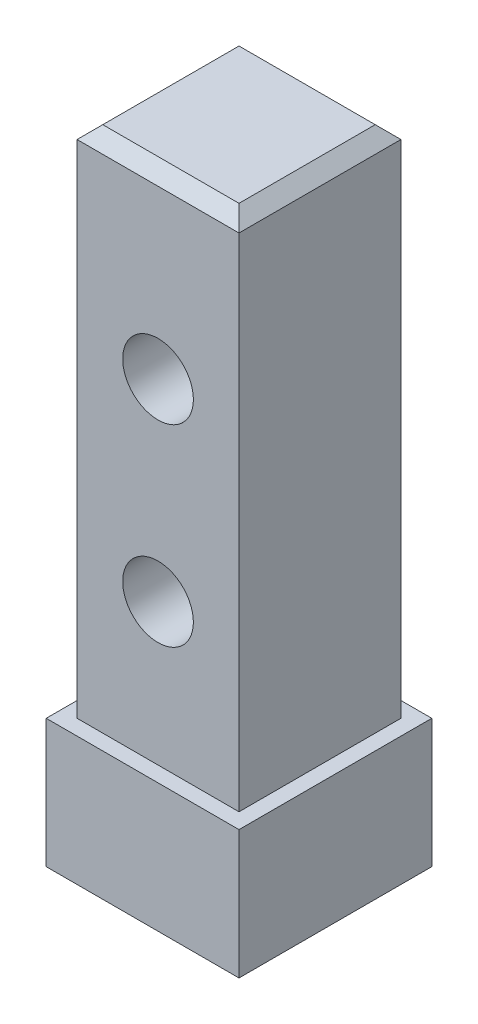
ISO-10303-21;
HEADER;
FILE_DESCRIPTION(('STEP AP214'),'2;1');
FILE_NAME('part.step','',(''),(''),'','','');
FILE_SCHEMA(('AUTOMOTIVE_DESIGN { 1 0 10303 214 1 1 1 1 }'));
ENDSEC;
DATA;
#1=APPLICATION_CONTEXT('core data for automotive mechanical design processes');
#2=APPLICATION_PROTOCOL_DEFINITION('international standard','automotive_design',2000,#1);
#3=PRODUCT_CONTEXT('',#1,'mechanical');
#4=PRODUCT('Part','Part','',(#3));
#5=PRODUCT_RELATED_PRODUCT_CATEGORY('part','',(#4));
#6=PRODUCT_DEFINITION_FORMATION('','',#4);
#7=PRODUCT_DEFINITION_CONTEXT('part definition',#1,'design');
#8=PRODUCT_DEFINITION('design','',#6,#7);
#9=PRODUCT_DEFINITION_SHAPE('','',#8);
#10=(LENGTH_UNIT() NAMED_UNIT(*) SI_UNIT(.MILLI.,.METRE.));
#11=(NAMED_UNIT(*) PLANE_ANGLE_UNIT() SI_UNIT($,.RADIAN.));
#12=(NAMED_UNIT(*) SI_UNIT($,.STERADIAN.) SOLID_ANGLE_UNIT());
#13=UNCERTAINTY_MEASURE_WITH_UNIT(LENGTH_MEASURE(1.E-05),#10,'distance_accuracy_value','');
#14=(GEOMETRIC_REPRESENTATION_CONTEXT(3) GLOBAL_UNCERTAINTY_ASSIGNED_CONTEXT((#13)) GLOBAL_UNIT_ASSIGNED_CONTEXT((#10,
#11,#12)) REPRESENTATION_CONTEXT('',''));
#15=CARTESIAN_POINT('',(0.,0.,0.));
#16=DIRECTION('',(0.,0.,1.));
#17=DIRECTION('',(1.,0.,0.));
#18=AXIS2_PLACEMENT_3D('',#15,#16,#17);
#19=CARTESIAN_POINT('',(-7.5,10.,-7.5));
#20=DIRECTION('',(0.,1.,0.));
#21=DIRECTION('',(0.,0.,1.));
#22=AXIS2_PLACEMENT_3D('',#19,#20,#21);
#23=PLANE('',#22);
#24=DIRECTION('',(-1.,0.,0.));
#25=VECTOR('',#24,1.);
#26=CARTESIAN_POINT('',(7.5,10.,-7.5));
#27=LINE('',#26,#25);
#28=CARTESIAN_POINT('',(7.5,10.,-7.5));
#29=VERTEX_POINT('',#28);
#30=CARTESIAN_POINT('',(-7.5,10.,-7.5));
#31=VERTEX_POINT('',#30);
#32=EDGE_CURVE('E160',#29,#31,#27,.T.);
#33=ORIENTED_EDGE('',*,*,#32,.T.);
#34=DIRECTION('',(0.,0.,1.));
#35=VECTOR('',#34,1.);
#36=CARTESIAN_POINT('',(-7.5,10.,-7.5));
#37=LINE('',#36,#35);
#38=CARTESIAN_POINT('',(-7.5,10.,7.5));
#39=VERTEX_POINT('',#38);
#40=EDGE_CURVE('E164',#31,#39,#37,.T.);
#41=ORIENTED_EDGE('',*,*,#40,.T.);
#42=DIRECTION('',(1.,0.,0.));
#43=VECTOR('',#42,1.);
#44=CARTESIAN_POINT('',(-7.5,10.,7.5));
#45=LINE('',#44,#43);
#46=CARTESIAN_POINT('',(7.5,10.,7.5));
#47=VERTEX_POINT('',#46);
#48=EDGE_CURVE('E168',#39,#47,#45,.T.);
#49=ORIENTED_EDGE('',*,*,#48,.T.);
#50=DIRECTION('',(0.,0.,-1.));
#51=VECTOR('',#50,1.);
#52=CARTESIAN_POINT('',(7.5,10.,7.5));
#53=LINE('',#52,#51);
#54=EDGE_CURVE('E171',#47,#29,#53,.T.);
#55=ORIENTED_EDGE('',*,*,#54,.T.);
#56=EDGE_LOOP('',(#33,#41,#49,#55));
#57=FACE_BOUND('',#56,.T.);
#58=DIRECTION('',(0.,0.,1.));
#59=VECTOR('',#58,1.);
#60=CARTESIAN_POINT('',(-6.3,10.,-6.3));
#61=LINE('',#60,#59);
#62=CARTESIAN_POINT('',(-6.3,10.,-6.3));
#63=VERTEX_POINT('',#62);
#64=CARTESIAN_POINT('',(-6.3,10.,6.3));
#65=VERTEX_POINT('',#64);
#66=EDGE_CURVE('E122',#63,#65,#61,.T.);
#67=ORIENTED_EDGE('',*,*,#66,.F.);
#68=DIRECTION('',(-1.,0.,0.));
#69=VECTOR('',#68,1.);
#70=CARTESIAN_POINT('',(6.3,10.,-6.3));
#71=LINE('',#70,#69);
#72=CARTESIAN_POINT('',(6.3,10.,-6.3));
#73=VERTEX_POINT('',#72);
#74=EDGE_CURVE('E131',#73,#63,#71,.T.);
#75=ORIENTED_EDGE('',*,*,#74,.F.);
#76=DIRECTION('',(0.,0.,-1.));
#77=VECTOR('',#76,1.);
#78=CARTESIAN_POINT('',(6.3,10.,6.3));
#79=LINE('',#78,#77);
#80=CARTESIAN_POINT('',(6.3,10.,6.3));
#81=VERTEX_POINT('',#80);
#82=EDGE_CURVE('E147',#81,#73,#79,.T.);
#83=ORIENTED_EDGE('',*,*,#82,.F.);
#84=DIRECTION('',(1.,0.,0.));
#85=VECTOR('',#84,1.);
#86=CARTESIAN_POINT('',(-6.3,10.,6.3));
#87=LINE('',#86,#85);
#88=EDGE_CURVE('E142',#65,#81,#87,.T.);
#89=ORIENTED_EDGE('',*,*,#88,.F.);
#90=EDGE_LOOP('',(#67,#75,#83,#89));
#91=FACE_BOUND('',#90,.T.);
#92=ADVANCED_FACE('F17',(#57,#91),#23,.T.);
#93=CARTESIAN_POINT('',(7.5,10.,-7.5));
#94=DIRECTION('',(0.,0.,1.));
#95=DIRECTION('',(1.,0.,0.));
#96=AXIS2_PLACEMENT_3D('',#93,#94,#95);
#97=PLANE('',#96);
#98=DIRECTION('',(-1.,0.,0.));
#99=VECTOR('',#98,1.);
#100=CARTESIAN_POINT('',(7.5,0.,-7.5));
#101=LINE('',#100,#99);
#102=CARTESIAN_POINT('',(7.5,0.,-7.5));
#103=VERTEX_POINT('',#102);
#104=CARTESIAN_POINT('',(-7.5,0.,-7.5));
#105=VERTEX_POINT('',#104);
#106=EDGE_CURVE('E127',#103,#105,#101,.T.);
#107=ORIENTED_EDGE('',*,*,#106,.T.);
#108=DIRECTION('',(0.,-1.,0.));
#109=VECTOR('',#108,1.);
#110=CARTESIAN_POINT('',(-7.5,10.,-7.5));
#111=LINE('',#110,#109);
#112=EDGE_CURVE('E197',#31,#105,#111,.T.);
#113=ORIENTED_EDGE('',*,*,#112,.F.);
#114=ORIENTED_EDGE('',*,*,#32,.F.);
#115=DIRECTION('',(0.,-1.,0.));
#116=VECTOR('',#115,1.);
#117=CARTESIAN_POINT('',(7.5,10.,-7.5));
#118=LINE('',#117,#116);
#119=EDGE_CURVE('E174',#29,#103,#118,.T.);
#120=ORIENTED_EDGE('',*,*,#119,.T.);
#121=EDGE_LOOP('',(#107,#113,#114,#120));
#122=FACE_BOUND('',#121,.T.);
#123=ADVANCED_FACE('F287',(#122),#97,.F.);
#124=CARTESIAN_POINT('',(-7.5,10.,-7.5));
#125=DIRECTION('',(1.,0.,0.));
#126=DIRECTION('',(0.,0.,-1.));
#127=AXIS2_PLACEMENT_3D('',#124,#125,#126);
#128=PLANE('',#127);
#129=DIRECTION('',(0.,0.,1.));
#130=VECTOR('',#129,1.);
#131=CARTESIAN_POINT('',(-7.5,0.,-7.5));
#132=LINE('',#131,#130);
#133=CARTESIAN_POINT('',(-7.5,0.,7.5));
#134=VERTEX_POINT('',#133);
#135=EDGE_CURVE('E178',#105,#134,#132,.T.);
#136=ORIENTED_EDGE('',*,*,#135,.T.);
#137=DIRECTION('',(0.,-1.,0.));
#138=VECTOR('',#137,1.);
#139=CARTESIAN_POINT('',(-7.5,10.,7.5));
#140=LINE('',#139,#138);
#141=EDGE_CURVE('E193',#39,#134,#140,.T.);
#142=ORIENTED_EDGE('',*,*,#141,.F.);
#143=ORIENTED_EDGE('',*,*,#40,.F.);
#144=ORIENTED_EDGE('',*,*,#112,.T.);
#145=EDGE_LOOP('',(#136,#142,#143,#144));
#146=FACE_BOUND('',#145,.T.);
#147=ADVANCED_FACE('F293',(#146),#128,.F.);
#148=CARTESIAN_POINT('',(-7.5,10.,7.5));
#149=DIRECTION('',(0.,0.,-1.));
#150=DIRECTION('',(-1.,0.,0.));
#151=AXIS2_PLACEMENT_3D('',#148,#149,#150);
#152=PLANE('',#151);
#153=DIRECTION('',(1.,0.,0.));
#154=VECTOR('',#153,1.);
#155=CARTESIAN_POINT('',(-7.5,0.,7.5));
#156=LINE('',#155,#154);
#157=CARTESIAN_POINT('',(7.5,0.,7.5));
#158=VERTEX_POINT('',#157);
#159=EDGE_CURVE('E181',#134,#158,#156,.T.);
#160=ORIENTED_EDGE('',*,*,#159,.T.);
#161=DIRECTION('',(0.,-1.,0.));
#162=VECTOR('',#161,1.);
#163=CARTESIAN_POINT('',(7.5,10.,7.5));
#164=LINE('',#163,#162);
#165=EDGE_CURVE('E189',#47,#158,#164,.T.);
#166=ORIENTED_EDGE('',*,*,#165,.F.);
#167=ORIENTED_EDGE('',*,*,#48,.F.);
#168=ORIENTED_EDGE('',*,*,#141,.T.);
#169=EDGE_LOOP('',(#160,#166,#167,#168));
#170=FACE_BOUND('',#169,.T.);
#171=ADVANCED_FACE('F306',(#170),#152,.F.);
#172=CARTESIAN_POINT('',(7.5,10.,7.5));
#173=DIRECTION('',(-1.,0.,0.));
#174=DIRECTION('',(0.,0.,1.));
#175=AXIS2_PLACEMENT_3D('',#172,#173,#174);
#176=PLANE('',#175);
#177=DIRECTION('',(0.,0.,-1.));
#178=VECTOR('',#177,1.);
#179=CARTESIAN_POINT('',(7.5,0.,7.5));
#180=LINE('',#179,#178);
#181=EDGE_CURVE('E165',#158,#103,#180,.T.);
#182=ORIENTED_EDGE('',*,*,#181,.T.);
#183=ORIENTED_EDGE('',*,*,#119,.F.);
#184=ORIENTED_EDGE('',*,*,#54,.F.);
#185=ORIENTED_EDGE('',*,*,#165,.T.);
#186=EDGE_LOOP('',(#182,#183,#184,#185));
#187=FACE_BOUND('',#186,.T.);
#188=ADVANCED_FACE('F302',(#187),#176,.F.);
#189=CARTESIAN_POINT('',(-7.5,0.,-7.5));
#190=DIRECTION('',(0.,1.,0.));
#191=DIRECTION('',(0.,0.,1.));
#192=AXIS2_PLACEMENT_3D('',#189,#190,#191);
#193=PLANE('',#192);
#194=CARTESIAN_POINT('',(0.,0.,0.));
#195=DIRECTION('',(0.,-1.,0.));
#196=DIRECTION('',(0.,0.,-1.));
#197=AXIS2_PLACEMENT_3D('',#194,#195,#196);
#198=CIRCLE('',#197,2.);
#199=CARTESIAN_POINT('',(0.,0.,-2.));
#200=VERTEX_POINT('',#199);
#201=EDGE_CURVE('E395',#200,#200,#198,.T.);
#202=ORIENTED_EDGE('',*,*,#201,.F.);
#203=EDGE_LOOP('',(#202));
#204=FACE_BOUND('',#203,.T.);
#205=ORIENTED_EDGE('',*,*,#106,.F.);
#206=ORIENTED_EDGE('',*,*,#181,.F.);
#207=ORIENTED_EDGE('',*,*,#159,.F.);
#208=ORIENTED_EDGE('',*,*,#135,.F.);
#209=EDGE_LOOP('',(#205,#206,#207,#208));
#210=FACE_BOUND('',#209,.T.);
#211=ADVANCED_FACE('F299',(#204,#210),#193,.F.);
#212=CARTESIAN_POINT('',(6.3,50.,-6.3));
#213=DIRECTION('',(0.,0.,1.));
#214=DIRECTION('',(1.,0.,0.));
#215=AXIS2_PLACEMENT_3D('',#212,#213,#214);
#216=PLANE('',#215);
#217=CARTESIAN_POINT('',(0.,36.,-6.3));
#218=DIRECTION('',(0.,0.,1.));
#219=DIRECTION('',(1.,0.,0.));
#220=AXIS2_PLACEMENT_3D('',#217,#218,#219);
#221=CIRCLE('',#220,2.75);
#222=CARTESIAN_POINT('',(2.75,36.,-6.3));
#223=VERTEX_POINT('',#222);
#224=EDGE_CURVE('E244',#223,#223,#221,.T.);
#225=ORIENTED_EDGE('',*,*,#224,.T.);
#226=EDGE_LOOP('',(#225));
#227=FACE_BOUND('',#226,.T.);
#228=CARTESIAN_POINT('',(0.,21.,-6.3));
#229=DIRECTION('',(0.,0.,1.));
#230=DIRECTION('',(1.,0.,0.));
#231=AXIS2_PLACEMENT_3D('',#228,#229,#230);
#232=CIRCLE('',#231,2.75);
#233=CARTESIAN_POINT('',(2.75,21.,-6.3));
#234=VERTEX_POINT('',#233);
#235=EDGE_CURVE('E139',#234,#234,#232,.T.);
#236=ORIENTED_EDGE('',*,*,#235,.T.);
#237=EDGE_LOOP('',(#236));
#238=FACE_BOUND('',#237,.T.);
#239=DIRECTION('',(0.,-1.,0.));
#240=VECTOR('',#239,1.);
#241=CARTESIAN_POINT('',(-6.3,50.,-6.3));
#242=LINE('',#241,#240);
#243=CARTESIAN_POINT('',(-6.3,49.,-6.3));
#244=VERTEX_POINT('',#243);
#245=EDGE_CURVE('E118',#244,#63,#242,.T.);
#246=ORIENTED_EDGE('',*,*,#245,.F.);
#247=DIRECTION('',(1.,0.,0.));
#248=VECTOR('',#247,1.);
#249=CARTESIAN_POINT('',(6.3,49.,-6.3));
#250=LINE('',#249,#248);
#251=CARTESIAN_POINT('',(6.3,49.,-6.3));
#252=VERTEX_POINT('',#251);
#253=EDGE_CURVE('E11',#244,#252,#250,.T.);
#254=ORIENTED_EDGE('',*,*,#253,.T.);
#255=DIRECTION('',(0.,-1.,0.));
#256=VECTOR('',#255,1.);
#257=CARTESIAN_POINT('',(6.3,50.,-6.3));
#258=LINE('',#257,#256);
#259=EDGE_CURVE('E134',#252,#73,#258,.T.);
#260=ORIENTED_EDGE('',*,*,#259,.T.);
#261=ORIENTED_EDGE('',*,*,#74,.T.);
#262=EDGE_LOOP('',(#246,#254,#260,#261));
#263=FACE_BOUND('',#262,.T.);
#264=ADVANCED_FACE('F132',(#227,#238,#263),#216,.F.);
#265=CARTESIAN_POINT('',(-6.3,50.,-6.3));
#266=DIRECTION('',(1.,0.,0.));
#267=DIRECTION('',(0.,0.,-1.));
#268=AXIS2_PLACEMENT_3D('',#265,#266,#267);
#269=PLANE('',#268);
#270=DIRECTION('',(0.,-1.,0.));
#271=VECTOR('',#270,1.);
#272=CARTESIAN_POINT('',(-6.3,50.,6.3));
#273=LINE('',#272,#271);
#274=CARTESIAN_POINT('',(-6.3,49.,6.3));
#275=VERTEX_POINT('',#274);
#276=EDGE_CURVE('E128',#275,#65,#273,.T.);
#277=ORIENTED_EDGE('',*,*,#276,.F.);
#278=DIRECTION('',(0.,0.,-1.));
#279=VECTOR('',#278,1.);
#280=CARTESIAN_POINT('',(-6.3,49.,-6.3));
#281=LINE('',#280,#279);
#282=EDGE_CURVE('E27',#275,#244,#281,.T.);
#283=ORIENTED_EDGE('',*,*,#282,.T.);
#284=ORIENTED_EDGE('',*,*,#245,.T.);
#285=ORIENTED_EDGE('',*,*,#66,.T.);
#286=EDGE_LOOP('',(#277,#283,#284,#285));
#287=FACE_BOUND('',#286,.T.);
#288=ADVANCED_FACE('F120',(#287),#269,.F.);
#289=CARTESIAN_POINT('',(-6.3,50.,6.3));
#290=DIRECTION('',(0.,0.,-1.));
#291=DIRECTION('',(-1.,0.,0.));
#292=AXIS2_PLACEMENT_3D('',#289,#290,#291);
#293=PLANE('',#292);
#294=CARTESIAN_POINT('',(0.,36.,6.3));
#295=DIRECTION('',(0.,0.,1.));
#296=DIRECTION('',(1.,0.,0.));
#297=AXIS2_PLACEMENT_3D('',#294,#295,#296);
#298=CIRCLE('',#297,2.75);
#299=CARTESIAN_POINT('',(2.75,36.,6.3));
#300=VERTEX_POINT('',#299);
#301=EDGE_CURVE('E237',#300,#300,#298,.T.);
#302=ORIENTED_EDGE('',*,*,#301,.F.);
#303=EDGE_LOOP('',(#302));
#304=FACE_BOUND('',#303,.T.);
#305=CARTESIAN_POINT('',(0.,21.,6.3));
#306=DIRECTION('',(0.,0.,1.));
#307=DIRECTION('',(1.,0.,0.));
#308=AXIS2_PLACEMENT_3D('',#305,#306,#307);
#309=CIRCLE('',#308,2.75);
#310=CARTESIAN_POINT('',(2.75,21.,6.3));
#311=VERTEX_POINT('',#310);
#312=EDGE_CURVE('E251',#311,#311,#309,.T.);
#313=ORIENTED_EDGE('',*,*,#312,.F.);
#314=EDGE_LOOP('',(#313));
#315=FACE_BOUND('',#314,.T.);
#316=DIRECTION('',(0.,-1.,0.));
#317=VECTOR('',#316,1.);
#318=CARTESIAN_POINT('',(6.3,50.,6.3));
#319=LINE('',#318,#317);
#320=CARTESIAN_POINT('',(6.3,49.,6.3));
#321=VERTEX_POINT('',#320);
#322=EDGE_CURVE('E155',#321,#81,#319,.T.);
#323=ORIENTED_EDGE('',*,*,#322,.F.);
#324=DIRECTION('',(-1.,0.,0.));
#325=VECTOR('',#324,1.);
#326=CARTESIAN_POINT('',(-6.3,49.,6.3));
#327=LINE('',#326,#325);
#328=EDGE_CURVE('E48',#321,#275,#327,.T.);
#329=ORIENTED_EDGE('',*,*,#328,.T.);
#330=ORIENTED_EDGE('',*,*,#276,.T.);
#331=ORIENTED_EDGE('',*,*,#88,.T.);
#332=EDGE_LOOP('',(#323,#329,#330,#331));
#333=FACE_BOUND('',#332,.T.);
#334=ADVANCED_FACE('F335',(#304,#315,#333),#293,.F.);
#335=CARTESIAN_POINT('',(6.3,50.,6.3));
#336=DIRECTION('',(-1.,0.,0.));
#337=DIRECTION('',(0.,0.,1.));
#338=AXIS2_PLACEMENT_3D('',#335,#336,#337);
#339=PLANE('',#338);
#340=ORIENTED_EDGE('',*,*,#259,.F.);
#341=DIRECTION('',(0.,0.,1.));
#342=VECTOR('',#341,1.);
#343=CARTESIAN_POINT('',(6.3,49.,6.3));
#344=LINE('',#343,#342);
#345=EDGE_CURVE('E214',#252,#321,#344,.T.);
#346=ORIENTED_EDGE('',*,*,#345,.T.);
#347=ORIENTED_EDGE('',*,*,#322,.T.);
#348=ORIENTED_EDGE('',*,*,#82,.T.);
#349=EDGE_LOOP('',(#340,#346,#347,#348));
#350=FACE_BOUND('',#349,.T.);
#351=ADVANCED_FACE('F281',(#350),#339,.F.);
#352=CARTESIAN_POINT('',(-6.3,50.,-6.3));
#353=DIRECTION('',(0.,1.,0.));
#354=DIRECTION('',(0.,0.,1.));
#355=AXIS2_PLACEMENT_3D('',#352,#353,#354);
#356=PLANE('',#355);
#357=DIRECTION('',(1.,0.,0.));
#358=VECTOR('',#357,1.);
#359=CARTESIAN_POINT('',(6.3,50.,5.3));
#360=LINE('',#359,#358);
#361=CARTESIAN_POINT('',(-5.3,50.,5.3));
#362=VERTEX_POINT('',#361);
#363=CARTESIAN_POINT('',(5.3,50.,5.3));
#364=VERTEX_POINT('',#363);
#365=EDGE_CURVE('E207',#362,#364,#360,.T.);
#366=ORIENTED_EDGE('',*,*,#365,.T.);
#367=DIRECTION('',(0.,0.,-1.));
#368=VECTOR('',#367,1.);
#369=CARTESIAN_POINT('',(5.3,50.,-6.3));
#370=LINE('',#369,#368);
#371=CARTESIAN_POINT('',(5.3,50.,-5.3));
#372=VERTEX_POINT('',#371);
#373=EDGE_CURVE('E210',#364,#372,#370,.T.);
#374=ORIENTED_EDGE('',*,*,#373,.T.);
#375=DIRECTION('',(-1.,0.,0.));
#376=VECTOR('',#375,1.);
#377=CARTESIAN_POINT('',(-6.3,50.,-5.3));
#378=LINE('',#377,#376);
#379=CARTESIAN_POINT('',(-5.3,50.,-5.3));
#380=VERTEX_POINT('',#379);
#381=EDGE_CURVE('E201',#372,#380,#378,.T.);
#382=ORIENTED_EDGE('',*,*,#381,.T.);
#383=DIRECTION('',(0.,0.,1.));
#384=VECTOR('',#383,1.);
#385=CARTESIAN_POINT('',(-5.3,50.,6.3));
#386=LINE('',#385,#384);
#387=EDGE_CURVE('E204',#380,#362,#386,.T.);
#388=ORIENTED_EDGE('',*,*,#387,.T.);
#389=EDGE_LOOP('',(#366,#374,#382,#388));
#390=FACE_BOUND('',#389,.T.);
#391=ADVANCED_FACE('F272',(#390),#356,.T.);
#392=CARTESIAN_POINT('',(0.,21.,-7.5));
#393=DIRECTION('',(0.,0.,1.));
#394=DIRECTION('',(1.,0.,0.));
#395=AXIS2_PLACEMENT_3D('',#392,#393,#394);
#396=CYLINDRICAL_SURFACE('',#395,2.75);
#397=CARTESIAN_POINT('',(0.,18.25,-2.));
#398=CARTESIAN_POINT('',(-0.0983557770938728,18.2500054544695,-1.99999428003419));
#399=CARTESIAN_POINT('',(-0.196880964191852,18.2553332268324,-1.99268603887788));
#400=CARTESIAN_POINT('',(-0.390861673478214,18.2761606849771,-1.96389819696719));
#401=CARTESIAN_POINT('',(-0.486308439767325,18.2916870894087,-1.94238137139336));
#402=CARTESIAN_POINT('',(-0.670803778740906,18.3314093778663,-1.88659912263835));
#403=CARTESIAN_POINT('',(-0.75988681208642,18.3555535146893,-1.85240974860864));
#404=CARTESIAN_POINT('',(-0.930508905816788,18.410656051087,-1.77285745659122));
#405=CARTESIAN_POINT('',(-1.01205046426951,18.4416121826649,-1.72749825690693));
#406=CARTESIAN_POINT('',(-1.17373245818838,18.5113677799703,-1.62249043099728));
#407=CARTESIAN_POINT('',(-1.25307114884623,18.5506245047796,-1.56191745941969));
#408=CARTESIAN_POINT('',(-1.40116339778715,18.6322146077073,-1.43057966110058));
#409=CARTESIAN_POINT('',(-1.46989985611624,18.6745527972555,-1.35979871876994));
#410=CARTESIAN_POINT('',(-1.60832980893295,18.767519323374,-1.19458237988732));
#411=CARTESIAN_POINT('',(-1.67569928217217,18.8181867751835,-1.09821104059915));
#412=CARTESIAN_POINT('',(-1.79343810153948,18.9138996989232,-0.89304130964128));
#413=CARTESIAN_POINT('',(-1.8438334563901,18.9589537047313,-0.784262275321589));
#414=CARTESIAN_POINT('',(-1.91181322095859,19.0229077659024,-0.592957318151633));
#415=CARTESIAN_POINT('',(-1.93473739848133,19.0455340025539,-0.513591428039175));
#416=CARTESIAN_POINT('',(-1.97075897548848,19.0818573115972,-0.350756985410887));
#417=CARTESIAN_POINT('',(-1.9838780842744,19.0955741014265,-0.267297935083063));
#418=CARTESIAN_POINT('',(-1.99944065360812,19.1119106285541,-0.0976294376915426));
#419=CARTESIAN_POINT('',(-2.00180572870248,19.1144488820298,-0.0114043949709109));
#420=CARTESIAN_POINT('',(-1.9954261688836,19.1077029016355,0.160190063491259));
#421=CARTESIAN_POINT('',(-1.98667335834597,19.0984099675973,0.245558802996062));
#422=CARTESIAN_POINT('',(-1.95717677753546,19.0680475555585,0.422381571296538));
#423=CARTESIAN_POINT('',(-1.9351665659419,19.045743547131,0.513402000983134));
#424=CARTESIAN_POINT('',(-1.87975898573234,18.9923954020725,0.689238095742704));
#425=CARTESIAN_POINT('',(-1.84633529623235,18.9613310922086,0.774038863434271));
#426=CARTESIAN_POINT('',(-1.7563937028541,18.8828743136332,0.964140865294565));
#427=CARTESIAN_POINT('',(-1.69588911360939,18.8335058424277,1.06673081274073));
#428=CARTESIAN_POINT('',(-1.55844240879352,18.7326102617625,1.25906504280732));
#429=CARTESIAN_POINT('',(-1.48148239524181,18.6810808513803,1.34879515931391));
#430=CARTESIAN_POINT('',(-1.31086280278707,18.5804795248259,1.5152597041543));
#431=CARTESIAN_POINT('',(-1.21700581729465,18.5314465531218,1.5918169571191));
#432=CARTESIAN_POINT('',(-1.0143671309455,18.4415289753234,1.7279684394132));
#433=CARTESIAN_POINT('',(-0.905620534197886,18.4006257425533,1.78760158234391));
#434=CARTESIAN_POINT('',(-0.705068260193079,18.3404184912901,1.87391531451594));
#435=CARTESIAN_POINT('',(-0.616061519917909,18.3182655579974,1.90512419831984));
#436=CARTESIAN_POINT('',(-0.432899072391936,18.2826899234643,1.95488638541905));
#437=CARTESIAN_POINT('',(-0.338747214345088,18.269260790078,1.97344901342001));
#438=CARTESIAN_POINT('',(-0.147500926308381,18.2522756625999,1.9968863432592));
#439=CARTESIAN_POINT('',(-0.0503970365338175,18.2487557683102,2.0017109977731));
#440=CARTESIAN_POINT('',(0.143309946452544,18.2520290884969,1.99720975551784));
#441=CARTESIAN_POINT('',(0.239913017849213,18.2588227484959,1.98788324744981));
#442=CARTESIAN_POINT('',(0.424227630652424,18.2814204532654,1.95659961462441));
#443=CARTESIAN_POINT('',(0.512133565075845,18.2966956877867,1.9353831442365));
#444=CARTESIAN_POINT('',(0.682812773313815,18.3346822122935,1.88195928884883));
#445=CARTESIAN_POINT('',(0.765584977164953,18.3573950462579,1.84974962170152));
#446=CARTESIAN_POINT('',(0.931274105037507,18.4109017568372,1.77250433254119));
#447=CARTESIAN_POINT('',(1.0136260634667,18.4422120225314,1.72662234914768));
#448=CARTESIAN_POINT('',(1.16973554369935,18.5097257641682,1.62493432033148));
#449=CARTESIAN_POINT('',(1.24348727106644,18.5459325040584,1.56912164729459));
#450=CARTESIAN_POINT('',(1.3945215601368,18.6279806826816,1.43773603654036));
#451=CARTESIAN_POINT('',(1.4699845944186,18.6743733906991,1.3604159632447));
#452=CARTESIAN_POINT('',(1.60760255819821,18.7672872941383,1.19466864140621));
#453=CARTESIAN_POINT('',(1.66974676575128,18.8138085627683,1.10623253439066));
#454=CARTESIAN_POINT('',(1.77314074166998,18.8970659156984,0.930111361071296));
#455=CARTESIAN_POINT('',(1.8160050423611,18.9343058293477,0.843616794891515));
#456=CARTESIAN_POINT('',(1.88946206781811,19.0012737359629,0.662873714106918));
#457=CARTESIAN_POINT('',(1.92008045356201,19.0310173882166,0.568641917743659));
#458=CARTESIAN_POINT('',(1.96223721058591,19.0731315507503,0.394726796813318));
#459=CARTESIAN_POINT('',(1.97646508016553,19.0878644233113,0.316283010720164));
#460=CARTESIAN_POINT('',(1.99542536290075,19.1076531840262,0.157094601773224));
#461=CARTESIAN_POINT('',(2.0001713602423,19.1127229155808,0.0763534388153094));
#462=CARTESIAN_POINT('',(1.99981885320569,19.1123494968051,-0.0852025656222564));
#463=CARTESIAN_POINT('',(1.994705653739,19.1068906536782,-0.166017337354174));
#464=CARTESIAN_POINT('',(1.97500835840108,19.086356054362,-0.325277611211625));
#465=CARTESIAN_POINT('',(1.96040931789738,19.0712651237982,-0.403719169982655));
#466=CARTESIAN_POINT('',(1.91684771543039,19.0278455574908,-0.579874625440154));
#467=CARTESIAN_POINT('',(1.88486355247138,18.9968841402137,-0.676175820481008));
#468=CARTESIAN_POINT('',(1.80815430123558,18.9273804528174,-0.860580264952934));
#469=CARTESIAN_POINT('',(1.76340772801855,18.8888254333717,-0.948669355036258));
#470=CARTESIAN_POINT('',(1.66090583412766,18.8072135497684,-1.11871653581239));
#471=CARTESIAN_POINT('',(1.60280724346827,18.7640577666994,-1.20041879000306));
#472=CARTESIAN_POINT('',(1.47507508069598,18.677802217245,-1.35431023663104));
#473=CARTESIAN_POINT('',(1.40543675582504,18.6347024813452,-1.4264954873051));
#474=CARTESIAN_POINT('',(1.23867652667567,18.5425375923894,-1.57502825217361));
#475=CARTESIAN_POINT('',(1.13887083780509,18.4942118660978,-1.64887046870142));
#476=CARTESIAN_POINT('',(0.924096989556689,18.4073409240647,-1.77810545514585));
#477=CARTESIAN_POINT('',(0.809150659719938,18.368781856522,-1.83352438960917));
#478=CARTESIAN_POINT('',(0.601795196344046,18.3151610406414,-1.90954282246817));
#479=CARTESIAN_POINT('',(0.51227184896005,18.2965355104356,-1.93556235400661));
#480=CARTESIAN_POINT('',(0.329253234716645,18.2682243038243,-1.97491534543777));
#481=CARTESIAN_POINT('',(0.235770857652045,18.2585116461981,-1.98828709673897));
#482=CARTESIAN_POINT('',(0.118144496565659,18.2524365535142,-1.99664836516441));
#483=CARTESIAN_POINT('',(0.0945466428426064,18.2515242402363,-1.99790374677741));
#484=CARTESIAN_POINT('',(0.0473024639909763,18.2503052612275,-1.99958031584967));
#485=CARTESIAN_POINT('',(0.0236561320033757,18.2499986881132,-2.00000137574294));
#486=CARTESIAN_POINT('',(0.,18.25,-2.));
#487=B_SPLINE_CURVE_WITH_KNOTS('',3,(#397,#398,#399,#400,#401,#402,#403,#404,#405,#406,#407,
#408,#409,#410,#411,#412,#413,#414,#415,#416,#417,#418,#419,#420,#421,#422,#423,#424,#425,#426,
#427,#428,#429,#430,#431,#432,#433,#434,#435,#436,#437,#438,#439,#440,#441,#442,#443,#444,#445,
#446,#447,#448,#449,#450,#451,#452,#453,#454,#455,#456,#457,#458,#459,#460,#461,#462,#463,#464,
#465,#466,#467,#468,#469,#470,#471,#472,#473,#474,#475,#476,#477,#478,#479,#480,#481,#482,#483,
#484,#485,#486),.UNSPECIFIED.,.T.,.F.,(4,2,2,2,2,2,2,2,2,2,2,2,2,2,2,2,2,2,2,2,2,2,2,2,2,2,2,2,
2,2,2,2,2,2,2,2,2,2,2,2,2,2,2,2,4),(0.,0.294963460367837,0.590702772605178,0.884695325437394,
1.17859014359616,1.49921123467337,1.82034415504185,2.20280382115507,2.58467476584957,
2.84071699835861,3.09619063718959,3.35352345272634,3.61104560956463,3.89826638016587,
4.18615404119102,4.57097500723991,4.95621667809484,5.3462917868924,5.73546259203865,
6.02491535844244,6.31415446543534,6.60444592833124,6.89474993153212,7.16871006315829,
7.44272710253663,7.73962338729185,8.03671856513626,8.38812892845594,8.73982113090954,
9.04918771684952,9.35790259375474,9.60010616558126,9.8419624953881,10.0841795896399,
10.3267792173246,10.6433185452629,10.9603939303469,11.2867757514025,11.6132923317964,
12.0107756184418,12.407691967689,12.6917427313977,12.9749307468548,13.045863315653,
13.1168067290529),.UNSPECIFIED.);
#488=CARTESIAN_POINT('',(0.,18.25,-2.));
#489=VERTEX_POINT('',#488);
#490=EDGE_CURVE('E226',#489,#489,#487,.T.);
#491=ORIENTED_EDGE('',*,*,#490,.F.);
#492=EDGE_LOOP('',(#491));
#493=FACE_BOUND('',#492,.T.);
#494=ORIENTED_EDGE('',*,*,#312,.T.);
#495=EDGE_LOOP('',(#494));
#496=FACE_BOUND('',#495,.T.);
#497=ORIENTED_EDGE('',*,*,#235,.F.);
#498=EDGE_LOOP('',(#497));
#499=FACE_BOUND('',#498,.T.);
#500=ADVANCED_FACE('F269',(#493,#496,#499),#396,.F.);
#501=CARTESIAN_POINT('',(0.,36.,-7.5));
#502=DIRECTION('',(0.,0.,1.));
#503=DIRECTION('',(1.,0.,0.));
#504=AXIS2_PLACEMENT_3D('',#501,#502,#503);
#505=CYLINDRICAL_SURFACE('',#504,2.75);
#506=ORIENTED_EDGE('',*,*,#301,.T.);
#507=EDGE_LOOP('',(#506));
#508=FACE_BOUND('',#507,.T.);
#509=ORIENTED_EDGE('',*,*,#224,.F.);
#510=EDGE_LOOP('',(#509));
#511=FACE_BOUND('',#510,.T.);
#512=ADVANCED_FACE('F271',(#508,#511),#505,.F.);
#513=CARTESIAN_POINT('',(-5.3,50.,-6.3));
#514=DIRECTION('',(-0.70710678118655,0.707106781186545,0.));
#515=DIRECTION('',(-0.707106781186545,-0.70710678118655,0.));
#516=AXIS2_PLACEMENT_3D('',#513,#514,#515);
#517=PLANE('',#516);
#518=DIRECTION('',(0.577350269189624,0.577350269189628,0.577350269189625));
#519=VECTOR('',#518,1.);
#520=CARTESIAN_POINT('',(-5.63333333333333,49.6666666666667,-5.63333333333334));
#521=LINE('',#520,#519);
#522=EDGE_CURVE('E228',#244,#380,#521,.T.);
#523=ORIENTED_EDGE('',*,*,#522,.F.);
#524=ORIENTED_EDGE('',*,*,#282,.F.);
#525=DIRECTION('',(0.577350269189625,0.577350269189629,-0.577350269189624));
#526=VECTOR('',#525,1.);
#527=CARTESIAN_POINT('',(-1.43333333333335,53.8666666666667,1.43333333333335));
#528=LINE('',#527,#526);
#529=EDGE_CURVE('E21',#362,#275,#528,.F.);
#530=ORIENTED_EDGE('',*,*,#529,.F.);
#531=ORIENTED_EDGE('',*,*,#387,.F.);
#532=EDGE_LOOP('',(#523,#524,#530,#531));
#533=FACE_BOUND('',#532,.T.);
#534=ADVANCED_FACE('F19',(#533),#517,.T.);
#535=CARTESIAN_POINT('',(-6.3,50.,5.3));
#536=DIRECTION('',(0.,0.707106781186545,0.70710678118655));
#537=DIRECTION('',(0.,-0.70710678118655,0.707106781186545));
#538=AXIS2_PLACEMENT_3D('',#535,#536,#537);
#539=PLANE('',#538);
#540=ORIENTED_EDGE('',*,*,#529,.T.);
#541=ORIENTED_EDGE('',*,*,#328,.F.);
#542=DIRECTION('',(-0.577350269189624,0.577350269189629,-0.577350269189625));
#543=VECTOR('',#542,1.);
#544=CARTESIAN_POINT('',(1.43333333333336,53.8666666666667,1.43333333333335));
#545=LINE('',#544,#543);
#546=EDGE_CURVE('E225',#364,#321,#545,.F.);
#547=ORIENTED_EDGE('',*,*,#546,.F.);
#548=ORIENTED_EDGE('',*,*,#365,.F.);
#549=EDGE_LOOP('',(#540,#541,#547,#548));
#550=FACE_BOUND('',#549,.T.);
#551=ADVANCED_FACE('F321',(#550),#539,.T.);
#552=CARTESIAN_POINT('',(-6.3,50.,-5.3));
#553=DIRECTION('',(0.,0.707106781186545,-0.70710678118655));
#554=DIRECTION('',(0.,0.70710678118655,0.707106781186545));
#555=AXIS2_PLACEMENT_3D('',#552,#553,#554);
#556=PLANE('',#555);
#557=ORIENTED_EDGE('',*,*,#522,.T.);
#558=ORIENTED_EDGE('',*,*,#381,.F.);
#559=DIRECTION('',(0.577350269189624,-0.577350269189629,-0.577350269189624));
#560=VECTOR('',#559,1.);
#561=CARTESIAN_POINT('',(1.43333333333336,53.8666666666667,-1.43333333333335));
#562=LINE('',#561,#560);
#563=EDGE_CURVE('E222',#252,#372,#562,.F.);
#564=ORIENTED_EDGE('',*,*,#563,.F.);
#565=ORIENTED_EDGE('',*,*,#253,.F.);
#566=EDGE_LOOP('',(#557,#558,#564,#565));
#567=FACE_BOUND('',#566,.T.);
#568=ADVANCED_FACE('F318',(#567),#556,.T.);
#569=CARTESIAN_POINT('',(5.3,50.,-6.3));
#570=DIRECTION('',(0.707106781186551,0.707106781186545,0.));
#571=DIRECTION('',(-0.707106781186545,0.707106781186551,0.));
#572=AXIS2_PLACEMENT_3D('',#569,#570,#571);
#573=PLANE('',#572);
#574=ORIENTED_EDGE('',*,*,#546,.T.);
#575=ORIENTED_EDGE('',*,*,#345,.F.);
#576=ORIENTED_EDGE('',*,*,#563,.T.);
#577=ORIENTED_EDGE('',*,*,#373,.F.);
#578=EDGE_LOOP('',(#574,#575,#576,#577));
#579=FACE_BOUND('',#578,.T.);
#580=ADVANCED_FACE('F314',(#579),#573,.T.);
#581=CARTESIAN_POINT('',(0.,50.001,0.));
#582=DIRECTION('',(0.,-1.,0.));
#583=DIRECTION('',(0.,0.,-1.));
#584=AXIS2_PLACEMENT_3D('',#581,#582,#583);
#585=CYLINDRICAL_SURFACE('',#584,2.);
#586=ORIENTED_EDGE('',*,*,#490,.T.);
#587=EDGE_LOOP('',(#586));
#588=FACE_BOUND('',#587,.T.);
#589=ORIENTED_EDGE('',*,*,#201,.T.);
#590=EDGE_LOOP('',(#589));
#591=FACE_BOUND('',#590,.T.);
#592=ADVANCED_FACE('F317',(#588,#591),#585,.F.);
#593=CLOSED_SHELL('',(#92,#123,#147,#171,#188,#211,#264,#288,#334,#351,#391,#500,#512,#534,#551,
#568,#580,#592));
#594=MANIFOLD_SOLID_BREP('B1',#593);
#595=ADVANCED_BREP_SHAPE_REPRESENTATION('',(#18,#594),#14);
#596=SHAPE_DEFINITION_REPRESENTATION(#9,#595);
ENDSEC;
END-ISO-10303-21;
